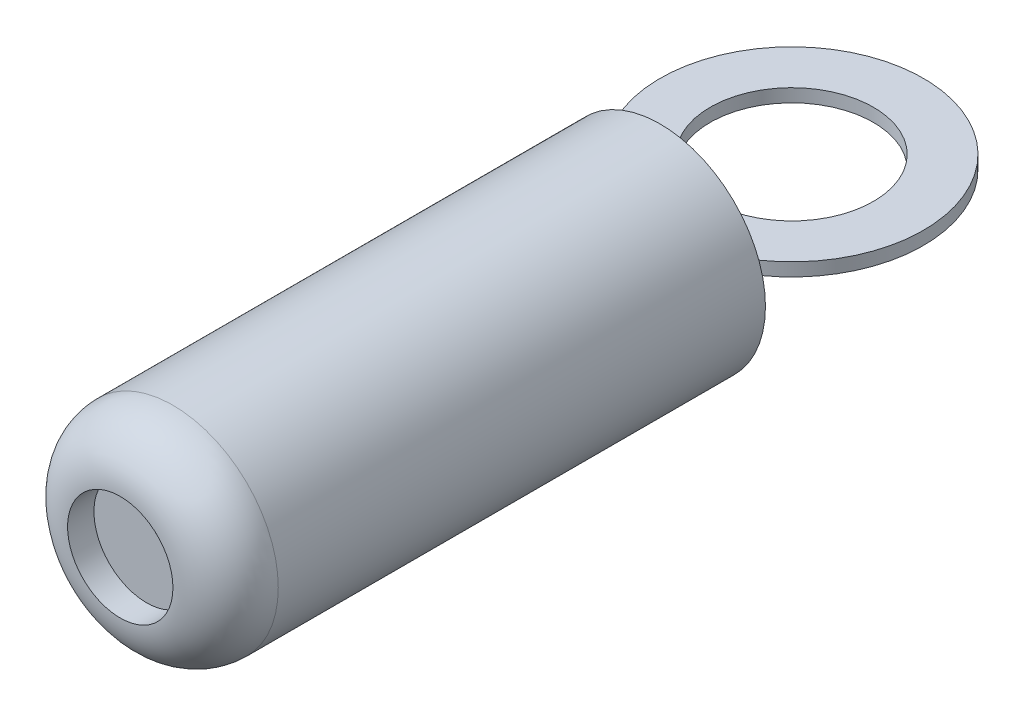
ISO-10303-21;
HEADER;
FILE_DESCRIPTION(('STEP AP214'),'2;1');
FILE_NAME('part.step','',(''),(''),'','','');
FILE_SCHEMA(('AUTOMOTIVE_DESIGN { 1 0 10303 214 1 1 1 1 }'));
ENDSEC;
DATA;
#1=APPLICATION_CONTEXT('core data for automotive mechanical design processes');
#2=APPLICATION_PROTOCOL_DEFINITION('international standard','automotive_design',2000,#1);
#3=PRODUCT_CONTEXT('',#1,'mechanical');
#4=PRODUCT('Part','Part','',(#3));
#5=PRODUCT_RELATED_PRODUCT_CATEGORY('part','',(#4));
#6=PRODUCT_DEFINITION_FORMATION('','',#4);
#7=PRODUCT_DEFINITION_CONTEXT('part definition',#1,'design');
#8=PRODUCT_DEFINITION('design','',#6,#7);
#9=PRODUCT_DEFINITION_SHAPE('','',#8);
#10=(LENGTH_UNIT() NAMED_UNIT(*) SI_UNIT(.MILLI.,.METRE.));
#11=(NAMED_UNIT(*) PLANE_ANGLE_UNIT() SI_UNIT($,.RADIAN.));
#12=(NAMED_UNIT(*) SI_UNIT($,.STERADIAN.) SOLID_ANGLE_UNIT());
#13=UNCERTAINTY_MEASURE_WITH_UNIT(LENGTH_MEASURE(1.E-05),#10,'distance_accuracy_value','');
#14=(GEOMETRIC_REPRESENTATION_CONTEXT(3) GLOBAL_UNCERTAINTY_ASSIGNED_CONTEXT((#13)) GLOBAL_UNIT_ASSIGNED_CONTEXT((#10,
#11,#12)) REPRESENTATION_CONTEXT('',''));
#15=CARTESIAN_POINT('',(0.,0.,0.));
#16=DIRECTION('',(0.,0.,1.));
#17=DIRECTION('',(1.,0.,0.));
#18=AXIS2_PLACEMENT_3D('',#15,#16,#17);
#19=CARTESIAN_POINT('',(0.,0.5,-5.));
#20=DIRECTION('',(0.,1.,0.));
#21=DIRECTION('',(0.,0.,1.));
#22=AXIS2_PLACEMENT_3D('',#19,#20,#21);
#23=PLANE('',#22);
#24=CARTESIAN_POINT('',(0.,0.5,-5.));
#25=DIRECTION('',(0.,1.,0.));
#26=DIRECTION('',(0.,0.,1.));
#27=AXIS2_PLACEMENT_3D('',#24,#25,#26);
#28=CIRCLE('',#27,5.);
#29=CARTESIAN_POINT('',(0.,0.5,0.));
#30=VERTEX_POINT('',#29);
#31=EDGE_CURVE('E11',#30,#30,#28,.T.);
#32=ORIENTED_EDGE('',*,*,#31,.T.);
#33=EDGE_LOOP('',(#32));
#34=FACE_BOUND('',#33,.T.);
#35=CARTESIAN_POINT('',(0.,0.5,-5.));
#36=DIRECTION('',(0.,1.,0.));
#37=DIRECTION('',(0.,0.,1.));
#38=AXIS2_PLACEMENT_3D('',#35,#36,#37);
#39=CIRCLE('',#38,3.1);
#40=CARTESIAN_POINT('',(0.,0.5,-1.9));
#41=VERTEX_POINT('',#40);
#42=EDGE_CURVE('E53',#41,#41,#39,.T.);
#43=ORIENTED_EDGE('',*,*,#42,.F.);
#44=EDGE_LOOP('',(#43));
#45=FACE_BOUND('',#44,.T.);
#46=ADVANCED_FACE('F42',(#34,#45),#23,.T.);
#47=CARTESIAN_POINT('',(0.,0.,-5.));
#48=DIRECTION('',(0.,1.,0.));
#49=DIRECTION('',(0.,0.,1.));
#50=AXIS2_PLACEMENT_3D('',#47,#48,#49);
#51=PLANE('',#50);
#52=CARTESIAN_POINT('',(0.,0.,-5.));
#53=DIRECTION('',(0.,1.,0.));
#54=DIRECTION('',(0.,0.,1.));
#55=AXIS2_PLACEMENT_3D('',#52,#53,#54);
#56=CIRCLE('',#55,5.);
#57=CARTESIAN_POINT('',(0.,0.,0.));
#58=VERTEX_POINT('',#57);
#59=EDGE_CURVE('E46',#58,#58,#56,.T.);
#60=ORIENTED_EDGE('',*,*,#59,.F.);
#61=EDGE_LOOP('',(#60));
#62=FACE_BOUND('',#61,.T.);
#63=CARTESIAN_POINT('',(0.,0.,-5.));
#64=DIRECTION('',(0.,1.,0.));
#65=DIRECTION('',(0.,0.,1.));
#66=AXIS2_PLACEMENT_3D('',#63,#64,#65);
#67=CIRCLE('',#66,3.1);
#68=CARTESIAN_POINT('',(0.,0.,-1.9));
#69=VERTEX_POINT('',#68);
#70=EDGE_CURVE('E55',#69,#69,#67,.T.);
#71=ORIENTED_EDGE('',*,*,#70,.T.);
#72=EDGE_LOOP('',(#71));
#73=FACE_BOUND('',#72,.T.);
#74=ADVANCED_FACE('F65',(#62,#73),#51,.F.);
#75=CARTESIAN_POINT('',(0.,0.5,-5.));
#76=DIRECTION('',(0.,-1.,0.));
#77=DIRECTION('',(0.,0.,-1.));
#78=AXIS2_PLACEMENT_3D('',#75,#76,#77);
#79=CYLINDRICAL_SURFACE('',#78,5.);
#80=ORIENTED_EDGE('',*,*,#31,.F.);
#81=EDGE_LOOP('',(#80));
#82=FACE_BOUND('',#81,.T.);
#83=ORIENTED_EDGE('',*,*,#59,.T.);
#84=EDGE_LOOP('',(#83));
#85=FACE_BOUND('',#84,.T.);
#86=ADVANCED_FACE('F44',(#82,#85),#79,.T.);
#87=CARTESIAN_POINT('',(0.,0.5,-5.));
#88=DIRECTION('',(0.,-1.,0.));
#89=DIRECTION('',(0.,0.,-1.));
#90=AXIS2_PLACEMENT_3D('',#87,#88,#89);
#91=CYLINDRICAL_SURFACE('',#90,3.1);
#92=ORIENTED_EDGE('',*,*,#42,.T.);
#93=EDGE_LOOP('',(#92));
#94=FACE_BOUND('',#93,.T.);
#95=ORIENTED_EDGE('',*,*,#70,.F.);
#96=EDGE_LOOP('',(#95));
#97=FACE_BOUND('',#96,.T.);
#98=ADVANCED_FACE('F61',(#94,#97),#91,.F.);
#99=CLOSED_SHELL('',(#46,#74,#86,#98));
#100=MANIFOLD_SOLID_BREP('B2',#99);
#101=CARTESIAN_POINT('',(0.,0.,20.5));
#102=DIRECTION('',(0.,0.,-1.));
#103=DIRECTION('',(-1.,0.,0.));
#104=AXIS2_PLACEMENT_3D('',#101,#102,#103);
#105=CYLINDRICAL_SURFACE('',#104,4.);
#106=CARTESIAN_POINT('',(0.,0.,18.5));
#107=DIRECTION('',(0.,0.,1.));
#108=DIRECTION('',(1.,0.,0.));
#109=AXIS2_PLACEMENT_3D('',#106,#107,#108);
#110=CIRCLE('',#109,4.);
#111=CARTESIAN_POINT('',(4.,0.,18.5));
#112=VERTEX_POINT('',#111);
#113=EDGE_CURVE('E41',#112,#112,#110,.F.);
#114=ORIENTED_EDGE('',*,*,#113,.T.);
#115=EDGE_LOOP('',(#114));
#116=FACE_BOUND('',#115,.T.);
#117=CARTESIAN_POINT('',(0.,0.,0.));
#118=DIRECTION('',(0.,0.,1.));
#119=DIRECTION('',(1.,0.,0.));
#120=AXIS2_PLACEMENT_3D('',#117,#118,#119);
#121=CIRCLE('',#120,4.);
#122=CARTESIAN_POINT('',(4.,0.,0.));
#123=VERTEX_POINT('',#122);
#124=EDGE_CURVE('E110',#123,#123,#121,.T.);
#125=ORIENTED_EDGE('',*,*,#124,.T.);
#126=EDGE_LOOP('',(#125));
#127=FACE_BOUND('',#126,.T.);
#128=ADVANCED_FACE('F103',(#116,#127),#105,.T.);
#129=CARTESIAN_POINT('',(0.,0.,0.));
#130=DIRECTION('',(0.,0.,1.));
#131=DIRECTION('',(1.,0.,0.));
#132=AXIS2_PLACEMENT_3D('',#129,#130,#131);
#133=PLANE('',#132);
#134=ORIENTED_EDGE('',*,*,#124,.F.);
#135=EDGE_LOOP('',(#134));
#136=FACE_BOUND('',#135,.T.);
#137=ADVANCED_FACE('F127',(#136),#133,.F.);
#138=CARTESIAN_POINT('',(0.,0.,18.5));
#139=DIRECTION('',(0.,0.,1.));
#140=DIRECTION('',(1.,0.,0.));
#141=AXIS2_PLACEMENT_3D('',#138,#139,#140);
#142=DEGENERATE_TOROIDAL_SURFACE('',#141,2.,2.,.T.);
#143=ORIENTED_EDGE('',*,*,#113,.F.);
#144=EDGE_LOOP('',(#143));
#145=FACE_BOUND('',#144,.T.);
#146=CARTESIAN_POINT('',(0.,0.,20.5));
#147=DIRECTION('',(0.,0.,1.));
#148=DIRECTION('',(1.,0.,0.));
#149=AXIS2_PLACEMENT_3D('',#146,#147,#148);
#150=CIRCLE('',#149,2.);
#151=CARTESIAN_POINT('',(2.,0.,20.5));
#152=VERTEX_POINT('',#151);
#153=EDGE_CURVE('E118',#152,#152,#150,.T.);
#154=ORIENTED_EDGE('',*,*,#153,.F.);
#155=EDGE_LOOP('',(#154));
#156=FACE_BOUND('',#155,.T.);
#157=ADVANCED_FACE('F105',(#145,#156),#142,.T.);
#158=CARTESIAN_POINT('',(0.,0.,19.5));
#159=DIRECTION('',(0.,0.,1.));
#160=DIRECTION('',(1.,0.,0.));
#161=AXIS2_PLACEMENT_3D('',#158,#159,#160);
#162=CYLINDRICAL_SURFACE('',#161,2.);
#163=CARTESIAN_POINT('',(0.,0.,19.5));
#164=DIRECTION('',(0.,0.,1.));
#165=DIRECTION('',(1.,0.,0.));
#166=AXIS2_PLACEMENT_3D('',#163,#164,#165);
#167=CIRCLE('',#166,2.);
#168=CARTESIAN_POINT('',(2.,0.,19.5));
#169=VERTEX_POINT('',#168);
#170=EDGE_CURVE('E114',#169,#169,#167,.T.);
#171=ORIENTED_EDGE('',*,*,#170,.F.);
#172=EDGE_LOOP('',(#171));
#173=FACE_BOUND('',#172,.T.);
#174=ORIENTED_EDGE('',*,*,#153,.T.);
#175=EDGE_LOOP('',(#174));
#176=FACE_BOUND('',#175,.T.);
#177=ADVANCED_FACE('F124',(#173,#176),#162,.F.);
#178=CARTESIAN_POINT('',(0.,0.,19.5));
#179=DIRECTION('',(0.,0.,1.));
#180=DIRECTION('',(1.,0.,0.));
#181=AXIS2_PLACEMENT_3D('',#178,#179,#180);
#182=PLANE('',#181);
#183=ORIENTED_EDGE('',*,*,#170,.T.);
#184=EDGE_LOOP('',(#183));
#185=FACE_BOUND('',#184,.T.);
#186=ADVANCED_FACE('F133',(#185),#182,.T.);
#187=CLOSED_SHELL('',(#128,#137,#157,#177,#186));
#188=MANIFOLD_SOLID_BREP('B6',#187);
#189=ADVANCED_BREP_SHAPE_REPRESENTATION('',(#18,#100,#188),#14);
#190=SHAPE_DEFINITION_REPRESENTATION(#9,#189);
ENDSEC;
END-ISO-10303-21;
